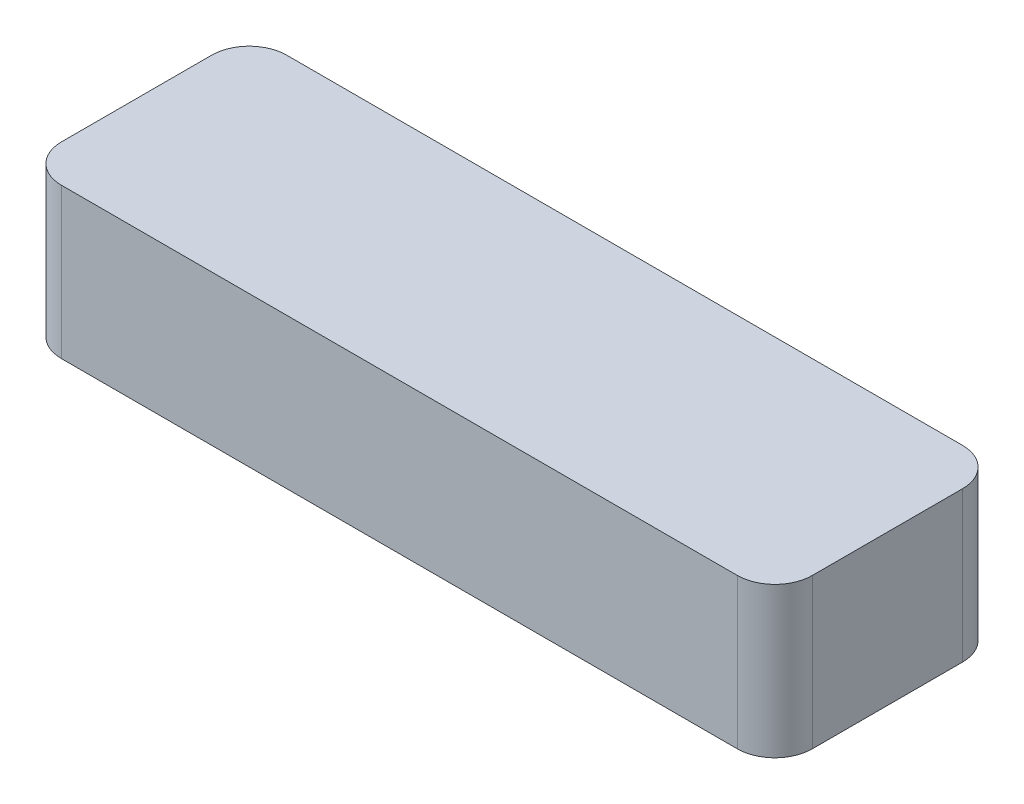
ISO-10303-21;
HEADER;
FILE_DESCRIPTION(('STEP AP214'),'2;1');
FILE_NAME('part.step','',(''),(''),'','','');
FILE_SCHEMA(('AUTOMOTIVE_DESIGN { 1 0 10303 214 1 1 1 1 }'));
ENDSEC;
DATA;
#1=APPLICATION_CONTEXT('core data for automotive mechanical design processes');
#2=APPLICATION_PROTOCOL_DEFINITION('international standard','automotive_design',2000,#1);
#3=PRODUCT_CONTEXT('',#1,'mechanical');
#4=PRODUCT('Part','Part','',(#3));
#5=PRODUCT_RELATED_PRODUCT_CATEGORY('part','',(#4));
#6=PRODUCT_DEFINITION_FORMATION('','',#4);
#7=PRODUCT_DEFINITION_CONTEXT('part definition',#1,'design');
#8=PRODUCT_DEFINITION('design','',#6,#7);
#9=PRODUCT_DEFINITION_SHAPE('','',#8);
#10=(LENGTH_UNIT() NAMED_UNIT(*) SI_UNIT(.MILLI.,.METRE.));
#11=(NAMED_UNIT(*) PLANE_ANGLE_UNIT() SI_UNIT($,.RADIAN.));
#12=(NAMED_UNIT(*) SI_UNIT($,.STERADIAN.) SOLID_ANGLE_UNIT());
#13=UNCERTAINTY_MEASURE_WITH_UNIT(LENGTH_MEASURE(1.E-05),#10,'distance_accuracy_value','');
#14=(GEOMETRIC_REPRESENTATION_CONTEXT(3) GLOBAL_UNCERTAINTY_ASSIGNED_CONTEXT((#13)) GLOBAL_UNIT_ASSIGNED_CONTEXT((#10,
#11,#12)) REPRESENTATION_CONTEXT('',''));
#15=CARTESIAN_POINT('',(0.,0.,0.));
#16=DIRECTION('',(0.,0.,1.));
#17=DIRECTION('',(1.,0.,0.));
#18=AXIS2_PLACEMENT_3D('',#15,#16,#17);
#19=CARTESIAN_POINT('',(-4.5,2.,-1.));
#20=DIRECTION('',(0.,-1.,0.));
#21=DIRECTION('',(0.,0.,-1.));
#22=AXIS2_PLACEMENT_3D('',#19,#20,#21);
#23=CYLINDRICAL_SURFACE('',#22,0.5);
#24=CARTESIAN_POINT('',(-4.5,0.,-1.));
#25=DIRECTION('',(0.,1.,0.));
#26=DIRECTION('',(0.,0.,-1.));
#27=AXIS2_PLACEMENT_3D('',#24,#25,#26);
#28=CIRCLE('',#27,0.5);
#29=CARTESIAN_POINT('',(-4.5,0.,-1.5));
#30=VERTEX_POINT('',#29);
#31=CARTESIAN_POINT('',(-5.,0.,-1.));
#32=VERTEX_POINT('',#31);
#33=EDGE_CURVE('E140',#30,#32,#28,.T.);
#34=ORIENTED_EDGE('',*,*,#33,.T.);
#35=DIRECTION('',(0.,-1.,0.));
#36=VECTOR('',#35,1.);
#37=CARTESIAN_POINT('',(-5.,2.,-1.));
#38=LINE('',#37,#36);
#39=CARTESIAN_POINT('',(-5.,2.,-1.));
#40=VERTEX_POINT('',#39);
#41=EDGE_CURVE('E11',#40,#32,#38,.T.);
#42=ORIENTED_EDGE('',*,*,#41,.F.);
#43=CARTESIAN_POINT('',(-4.5,2.,-1.));
#44=DIRECTION('',(0.,1.,0.));
#45=DIRECTION('',(0.,0.,-1.));
#46=AXIS2_PLACEMENT_3D('',#43,#44,#45);
#47=CIRCLE('',#46,0.5);
#48=CARTESIAN_POINT('',(-4.5,2.,-1.5));
#49=VERTEX_POINT('',#48);
#50=EDGE_CURVE('E162',#49,#40,#47,.T.);
#51=ORIENTED_EDGE('',*,*,#50,.F.);
#52=DIRECTION('',(0.,-1.,0.));
#53=VECTOR('',#52,1.);
#54=CARTESIAN_POINT('',(-4.5,2.,-1.5));
#55=LINE('',#54,#53);
#56=EDGE_CURVE('E136',#49,#30,#55,.T.);
#57=ORIENTED_EDGE('',*,*,#56,.T.);
#58=EDGE_LOOP('',(#34,#42,#51,#57));
#59=FACE_BOUND('',#58,.T.);
#60=ADVANCED_FACE('F39',(#59),#23,.T.);
#61=CARTESIAN_POINT('',(-5.,2.,-1.));
#62=DIRECTION('',(1.,0.,0.));
#63=DIRECTION('',(0.,0.,-1.));
#64=AXIS2_PLACEMENT_3D('',#61,#62,#63);
#65=PLANE('',#64);
#66=DIRECTION('',(0.,0.,1.));
#67=VECTOR('',#66,1.);
#68=CARTESIAN_POINT('',(-5.,0.,-1.));
#69=LINE('',#68,#67);
#70=CARTESIAN_POINT('',(-5.,0.,1.));
#71=VERTEX_POINT('',#70);
#72=EDGE_CURVE('E144',#32,#71,#69,.T.);
#73=ORIENTED_EDGE('',*,*,#72,.T.);
#74=DIRECTION('',(0.,-1.,0.));
#75=VECTOR('',#74,1.);
#76=CARTESIAN_POINT('',(-5.,2.,1.));
#77=LINE('',#76,#75);
#78=CARTESIAN_POINT('',(-5.,2.,1.));
#79=VERTEX_POINT('',#78);
#80=EDGE_CURVE('E48',#79,#71,#77,.T.);
#81=ORIENTED_EDGE('',*,*,#80,.F.);
#82=DIRECTION('',(0.,0.,1.));
#83=VECTOR('',#82,1.);
#84=CARTESIAN_POINT('',(-5.,2.,-1.));
#85=LINE('',#84,#83);
#86=EDGE_CURVE('E99',#40,#79,#85,.T.);
#87=ORIENTED_EDGE('',*,*,#86,.F.);
#88=ORIENTED_EDGE('',*,*,#41,.T.);
#89=EDGE_LOOP('',(#73,#81,#87,#88));
#90=FACE_BOUND('',#89,.T.);
#91=ADVANCED_FACE('F208',(#90),#65,.F.);
#92=CARTESIAN_POINT('',(-4.5,2.,1.));
#93=DIRECTION('',(0.,-1.,0.));
#94=DIRECTION('',(0.,0.,-1.));
#95=AXIS2_PLACEMENT_3D('',#92,#93,#94);
#96=CYLINDRICAL_SURFACE('',#95,0.5);
#97=CARTESIAN_POINT('',(-4.5,0.,1.));
#98=DIRECTION('',(0.,1.,0.));
#99=DIRECTION('',(0.,0.,1.));
#100=AXIS2_PLACEMENT_3D('',#97,#98,#99);
#101=CIRCLE('',#100,0.5);
#102=CARTESIAN_POINT('',(-4.5,0.,1.5));
#103=VERTEX_POINT('',#102);
#104=EDGE_CURVE('E147',#71,#103,#101,.T.);
#105=ORIENTED_EDGE('',*,*,#104,.T.);
#106=DIRECTION('',(0.,-1.,0.));
#107=VECTOR('',#106,1.);
#108=CARTESIAN_POINT('',(-4.5,2.,1.5));
#109=LINE('',#108,#107);
#110=CARTESIAN_POINT('',(-4.5,2.,1.5));
#111=VERTEX_POINT('',#110);
#112=EDGE_CURVE('E173',#111,#103,#109,.T.);
#113=ORIENTED_EDGE('',*,*,#112,.F.);
#114=CARTESIAN_POINT('',(-4.5,2.,1.));
#115=DIRECTION('',(0.,1.,0.));
#116=DIRECTION('',(0.,0.,1.));
#117=AXIS2_PLACEMENT_3D('',#114,#115,#116);
#118=CIRCLE('',#117,0.5);
#119=EDGE_CURVE('E183',#79,#111,#118,.T.);
#120=ORIENTED_EDGE('',*,*,#119,.F.);
#121=ORIENTED_EDGE('',*,*,#80,.T.);
#122=EDGE_LOOP('',(#105,#113,#120,#121));
#123=FACE_BOUND('',#122,.T.);
#124=ADVANCED_FACE('F181',(#123),#96,.T.);
#125=CARTESIAN_POINT('',(-4.5,2.,1.5));
#126=DIRECTION('',(0.,0.,-1.));
#127=DIRECTION('',(-1.,0.,0.));
#128=AXIS2_PLACEMENT_3D('',#125,#126,#127);
#129=PLANE('',#128);
#130=DIRECTION('',(1.,0.,0.));
#131=VECTOR('',#130,1.);
#132=CARTESIAN_POINT('',(-4.5,0.,1.5));
#133=LINE('',#132,#131);
#134=CARTESIAN_POINT('',(4.5,0.,1.50000000000001));
#135=VERTEX_POINT('',#134);
#136=EDGE_CURVE('E150',#103,#135,#133,.T.);
#137=ORIENTED_EDGE('',*,*,#136,.T.);
#138=DIRECTION('',(0.,-1.,0.));
#139=VECTOR('',#138,1.);
#140=CARTESIAN_POINT('',(4.5,2.,1.50000000000001));
#141=LINE('',#140,#139);
#142=CARTESIAN_POINT('',(4.5,2.,1.50000000000001));
#143=VERTEX_POINT('',#142);
#144=EDGE_CURVE('E169',#143,#135,#141,.T.);
#145=ORIENTED_EDGE('',*,*,#144,.F.);
#146=DIRECTION('',(1.,0.,0.));
#147=VECTOR('',#146,1.);
#148=CARTESIAN_POINT('',(-4.5,2.,1.5));
#149=LINE('',#148,#147);
#150=EDGE_CURVE('E196',#111,#143,#149,.T.);
#151=ORIENTED_EDGE('',*,*,#150,.F.);
#152=ORIENTED_EDGE('',*,*,#112,.T.);
#153=EDGE_LOOP('',(#137,#145,#151,#152));
#154=FACE_BOUND('',#153,.T.);
#155=ADVANCED_FACE('F191',(#154),#129,.F.);
#156=CARTESIAN_POINT('',(4.5,2.,1.00000000000001));
#157=DIRECTION('',(0.,-1.,0.));
#158=DIRECTION('',(0.,0.,-1.));
#159=AXIS2_PLACEMENT_3D('',#156,#157,#158);
#160=CYLINDRICAL_SURFACE('',#159,0.5);
#161=CARTESIAN_POINT('',(4.5,0.,1.00000000000001));
#162=DIRECTION('',(0.,1.,0.));
#163=DIRECTION('',(0.,0.,-1.));
#164=AXIS2_PLACEMENT_3D('',#161,#162,#163);
#165=CIRCLE('',#164,0.5);
#166=CARTESIAN_POINT('',(5.,0.,1.00000000000001));
#167=VERTEX_POINT('',#166);
#168=EDGE_CURVE('E153',#135,#167,#165,.T.);
#169=ORIENTED_EDGE('',*,*,#168,.T.);
#170=DIRECTION('',(0.,-1.,0.));
#171=VECTOR('',#170,1.);
#172=CARTESIAN_POINT('',(5.,2.,1.00000000000001));
#173=LINE('',#172,#171);
#174=CARTESIAN_POINT('',(5.,2.,1.00000000000001));
#175=VERTEX_POINT('',#174);
#176=EDGE_CURVE('E129',#175,#167,#173,.T.);
#177=ORIENTED_EDGE('',*,*,#176,.F.);
#178=CARTESIAN_POINT('',(4.5,2.,1.00000000000001));
#179=DIRECTION('',(0.,1.,0.));
#180=DIRECTION('',(0.,0.,-1.));
#181=AXIS2_PLACEMENT_3D('',#178,#179,#180);
#182=CIRCLE('',#181,0.5);
#183=EDGE_CURVE('E118',#143,#175,#182,.T.);
#184=ORIENTED_EDGE('',*,*,#183,.F.);
#185=ORIENTED_EDGE('',*,*,#144,.T.);
#186=EDGE_LOOP('',(#169,#177,#184,#185));
#187=FACE_BOUND('',#186,.T.);
#188=ADVANCED_FACE('F194',(#187),#160,.T.);
#189=CARTESIAN_POINT('',(5.,2.,-0.999999999999994));
#190=DIRECTION('',(-1.,0.,0.));
#191=DIRECTION('',(0.,0.,1.));
#192=AXIS2_PLACEMENT_3D('',#189,#190,#191);
#193=PLANE('',#192);
#194=DIRECTION('',(0.,0.,-1.));
#195=VECTOR('',#194,1.);
#196=CARTESIAN_POINT('',(5.,0.,-0.999999999999994));
#197=LINE('',#196,#195);
#198=CARTESIAN_POINT('',(5.,0.,-0.999999999999994));
#199=VERTEX_POINT('',#198);
#200=EDGE_CURVE('E127',#167,#199,#197,.T.);
#201=ORIENTED_EDGE('',*,*,#200,.T.);
#202=DIRECTION('',(0.,-1.,0.));
#203=VECTOR('',#202,1.);
#204=CARTESIAN_POINT('',(5.,2.,-0.999999999999994));
#205=LINE('',#204,#203);
#206=CARTESIAN_POINT('',(5.,2.,-0.999999999999994));
#207=VERTEX_POINT('',#206);
#208=EDGE_CURVE('E124',#207,#199,#205,.T.);
#209=ORIENTED_EDGE('',*,*,#208,.F.);
#210=DIRECTION('',(0.,0.,-1.));
#211=VECTOR('',#210,1.);
#212=CARTESIAN_POINT('',(5.,2.,-0.999999999999994));
#213=LINE('',#212,#211);
#214=EDGE_CURVE('E112',#175,#207,#213,.T.);
#215=ORIENTED_EDGE('',*,*,#214,.F.);
#216=ORIENTED_EDGE('',*,*,#176,.T.);
#217=EDGE_LOOP('',(#201,#209,#215,#216));
#218=FACE_BOUND('',#217,.T.);
#219=ADVANCED_FACE('F125',(#218),#193,.F.);
#220=CARTESIAN_POINT('',(4.5,2.,-0.999999999999995));
#221=DIRECTION('',(0.,-1.,0.));
#222=DIRECTION('',(0.,0.,-1.));
#223=AXIS2_PLACEMENT_3D('',#220,#221,#222);
#224=CYLINDRICAL_SURFACE('',#223,0.5);
#225=CARTESIAN_POINT('',(4.5,0.,-0.999999999999995));
#226=DIRECTION('',(0.,1.,0.));
#227=DIRECTION('',(0.,0.,1.));
#228=AXIS2_PLACEMENT_3D('',#225,#226,#227);
#229=CIRCLE('',#228,0.5);
#230=CARTESIAN_POINT('',(4.5,0.,-1.49999999999999));
#231=VERTEX_POINT('',#230);
#232=EDGE_CURVE('E85',#199,#231,#229,.T.);
#233=ORIENTED_EDGE('',*,*,#232,.T.);
#234=DIRECTION('',(0.,-1.,0.));
#235=VECTOR('',#234,1.);
#236=CARTESIAN_POINT('',(4.5,2.,-1.49999999999999));
#237=LINE('',#236,#235);
#238=CARTESIAN_POINT('',(4.5,2.,-1.49999999999999));
#239=VERTEX_POINT('',#238);
#240=EDGE_CURVE('E130',#239,#231,#237,.T.);
#241=ORIENTED_EDGE('',*,*,#240,.F.);
#242=CARTESIAN_POINT('',(4.5,2.,-0.999999999999995));
#243=DIRECTION('',(0.,1.,0.));
#244=DIRECTION('',(0.,0.,1.));
#245=AXIS2_PLACEMENT_3D('',#242,#243,#244);
#246=CIRCLE('',#245,0.5);
#247=EDGE_CURVE('E116',#207,#239,#246,.T.);
#248=ORIENTED_EDGE('',*,*,#247,.F.);
#249=ORIENTED_EDGE('',*,*,#208,.T.);
#250=EDGE_LOOP('',(#233,#241,#248,#249));
#251=FACE_BOUND('',#250,.T.);
#252=ADVANCED_FACE('F132',(#251),#224,.T.);
#253=CARTESIAN_POINT('',(-4.5,2.,-1.5));
#254=DIRECTION('',(0.,0.,1.));
#255=DIRECTION('',(1.,0.,0.));
#256=AXIS2_PLACEMENT_3D('',#253,#254,#255);
#257=PLANE('',#256);
#258=DIRECTION('',(-1.,0.,0.));
#259=VECTOR('',#258,1.);
#260=CARTESIAN_POINT('',(-4.5,0.,-1.5));
#261=LINE('',#260,#259);
#262=EDGE_CURVE('E91',#231,#30,#261,.T.);
#263=ORIENTED_EDGE('',*,*,#262,.T.);
#264=ORIENTED_EDGE('',*,*,#56,.F.);
#265=DIRECTION('',(-1.,0.,0.));
#266=VECTOR('',#265,1.);
#267=CARTESIAN_POINT('',(-4.5,2.,-1.5));
#268=LINE('',#267,#266);
#269=EDGE_CURVE('E56',#239,#49,#268,.T.);
#270=ORIENTED_EDGE('',*,*,#269,.F.);
#271=ORIENTED_EDGE('',*,*,#240,.T.);
#272=EDGE_LOOP('',(#263,#264,#270,#271));
#273=FACE_BOUND('',#272,.T.);
#274=ADVANCED_FACE('F224',(#273),#257,.F.);
#275=CARTESIAN_POINT('',(-4.5,2.,-1.));
#276=DIRECTION('',(0.,-1.,0.));
#277=DIRECTION('',(0.,0.,-1.));
#278=AXIS2_PLACEMENT_3D('',#275,#276,#277);
#279=PLANE('',#278);
#280=ORIENTED_EDGE('',*,*,#50,.T.);
#281=ORIENTED_EDGE('',*,*,#86,.T.);
#282=ORIENTED_EDGE('',*,*,#119,.T.);
#283=ORIENTED_EDGE('',*,*,#150,.T.);
#284=ORIENTED_EDGE('',*,*,#183,.T.);
#285=ORIENTED_EDGE('',*,*,#214,.T.);
#286=ORIENTED_EDGE('',*,*,#247,.T.);
#287=ORIENTED_EDGE('',*,*,#269,.T.);
#288=EDGE_LOOP('',(#280,#281,#282,#283,#284,#285,#286,#287));
#289=FACE_BOUND('',#288,.T.);
#290=ADVANCED_FACE('F114',(#289),#279,.F.);
#291=CARTESIAN_POINT('',(-4.5,0.,-1.));
#292=DIRECTION('',(0.,-1.,0.));
#293=DIRECTION('',(0.,0.,-1.));
#294=AXIS2_PLACEMENT_3D('',#291,#292,#293);
#295=PLANE('',#294);
#296=ORIENTED_EDGE('',*,*,#33,.F.);
#297=ORIENTED_EDGE('',*,*,#262,.F.);
#298=ORIENTED_EDGE('',*,*,#232,.F.);
#299=ORIENTED_EDGE('',*,*,#200,.F.);
#300=ORIENTED_EDGE('',*,*,#168,.F.);
#301=ORIENTED_EDGE('',*,*,#136,.F.);
#302=ORIENTED_EDGE('',*,*,#104,.F.);
#303=ORIENTED_EDGE('',*,*,#72,.F.);
#304=EDGE_LOOP('',(#296,#297,#298,#299,#300,#301,#302,#303));
#305=FACE_BOUND('',#304,.T.);
#306=ADVANCED_FACE('F187',(#305),#295,.T.);
#307=CLOSED_SHELL('',(#60,#91,#124,#155,#188,#219,#252,#274,#290,#306));
#308=MANIFOLD_SOLID_BREP('B2',#307);
#309=ADVANCED_BREP_SHAPE_REPRESENTATION('',(#18,#308),#14);
#310=SHAPE_DEFINITION_REPRESENTATION(#9,#309);
ENDSEC;
END-ISO-10303-21;
